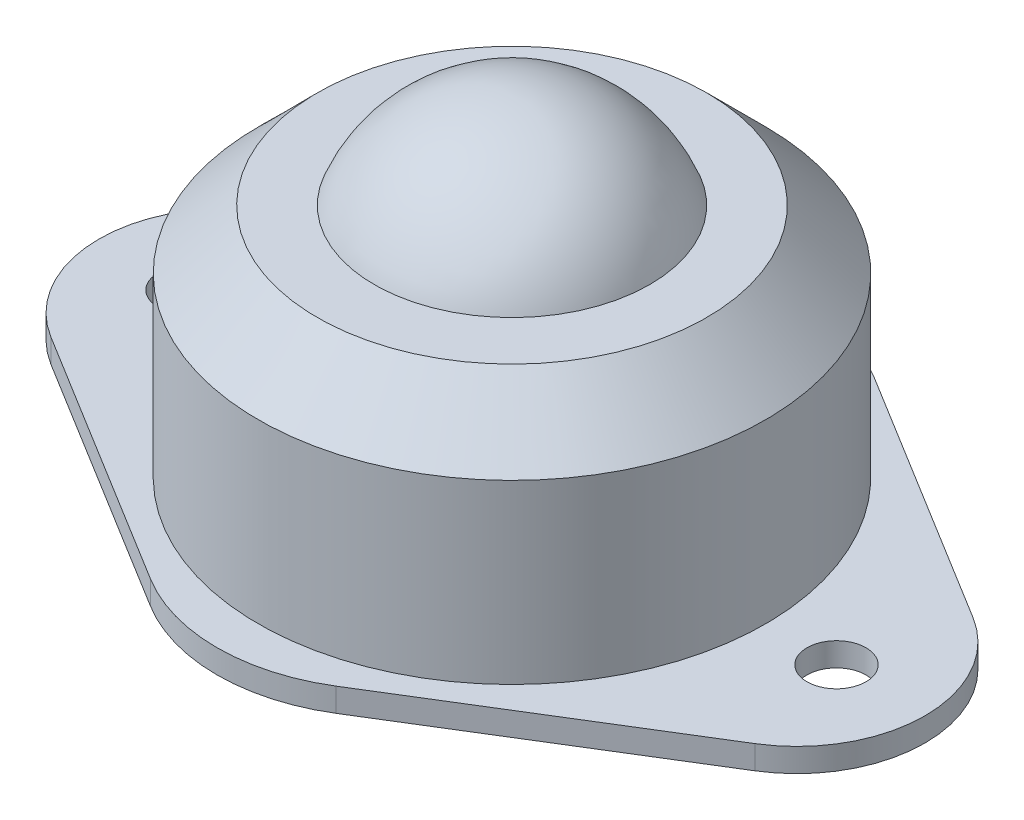
ISO-10303-21;
HEADER;
FILE_DESCRIPTION(('STEP AP214'),'2;1');
FILE_NAME('part.step','',(''),(''),'','','');
FILE_SCHEMA(('AUTOMOTIVE_DESIGN { 1 0 10303 214 1 1 1 1 }'));
ENDSEC;
DATA;
#1=APPLICATION_CONTEXT('core data for automotive mechanical design processes');
#2=APPLICATION_PROTOCOL_DEFINITION('international standard','automotive_design',2000,#1);
#3=PRODUCT_CONTEXT('',#1,'mechanical');
#4=PRODUCT('Part','Part','',(#3));
#5=PRODUCT_RELATED_PRODUCT_CATEGORY('part','',(#4));
#6=PRODUCT_DEFINITION_FORMATION('','',#4);
#7=PRODUCT_DEFINITION_CONTEXT('part definition',#1,'design');
#8=PRODUCT_DEFINITION('design','',#6,#7);
#9=PRODUCT_DEFINITION_SHAPE('','',#8);
#10=(LENGTH_UNIT() NAMED_UNIT(*) SI_UNIT(.MILLI.,.METRE.));
#11=(NAMED_UNIT(*) PLANE_ANGLE_UNIT() SI_UNIT($,.RADIAN.));
#12=(NAMED_UNIT(*) SI_UNIT($,.STERADIAN.) SOLID_ANGLE_UNIT());
#13=UNCERTAINTY_MEASURE_WITH_UNIT(LENGTH_MEASURE(1.E-05),#10,'distance_accuracy_value','');
#14=(GEOMETRIC_REPRESENTATION_CONTEXT(3) GLOBAL_UNCERTAINTY_ASSIGNED_CONTEXT((#13)) GLOBAL_UNIT_ASSIGNED_CONTEXT((#10,
#11,#12)) REPRESENTATION_CONTEXT('',''));
#15=CARTESIAN_POINT('',(0.,0.,0.));
#16=DIRECTION('',(0.,0.,1.));
#17=DIRECTION('',(1.,0.,0.));
#18=AXIS2_PLACEMENT_3D('',#15,#16,#17);
#19=CARTESIAN_POINT('',(0.,0.,0.));
#20=DIRECTION('',(0.,-1.,0.));
#21=DIRECTION('',(1.,0.,0.));
#22=AXIS2_PLACEMENT_3D('',#19,#20,#21);
#23=SPHERICAL_SURFACE('',#22,12.5);
#24=CARTESIAN_POINT('',(0.,4.48054135447175,0.));
#25=DIRECTION('',(0.,-1.,0.));
#26=DIRECTION('',(0.,0.,-1.));
#27=AXIS2_PLACEMENT_3D('',#24,#25,#26);
#28=CIRCLE('',#27,11.6693936933702);
#29=CARTESIAN_POINT('',(0.,4.48054135447175,-11.6693936933702));
#30=VERTEX_POINT('',#29);
#31=EDGE_CURVE('E11',#30,#30,#28,.T.);
#32=ORIENTED_EDGE('',*,*,#31,.F.);
#33=EDGE_LOOP('',(#32));
#34=FACE_BOUND('',#33,.T.);
#35=ADVANCED_FACE('F40',(#34),#23,.T.);
#36=CARTESIAN_POINT('',(0.,4.48054135447175,0.));
#37=DIRECTION('',(0.,-1.,0.));
#38=DIRECTION('',(0.,0.,-1.));
#39=AXIS2_PLACEMENT_3D('',#36,#37,#38);
#40=PLANE('',#39);
#41=CARTESIAN_POINT('',(0.,4.48054135447175,0.));
#42=DIRECTION('',(0.,-1.,0.));
#43=DIRECTION('',(0.,0.,-1.));
#44=AXIS2_PLACEMENT_3D('',#41,#42,#43);
#45=CIRCLE('',#44,16.5);
#46=CARTESIAN_POINT('',(0.,4.48054135447175,-16.5));
#47=VERTEX_POINT('',#46);
#48=EDGE_CURVE('E49',#47,#47,#45,.T.);
#49=ORIENTED_EDGE('',*,*,#48,.F.);
#50=EDGE_LOOP('',(#49));
#51=FACE_BOUND('',#50,.T.);
#52=ORIENTED_EDGE('',*,*,#31,.T.);
#53=EDGE_LOOP('',(#52));
#54=FACE_BOUND('',#53,.T.);
#55=ADVANCED_FACE('F201',(#51,#54),#40,.F.);
#56=CARTESIAN_POINT('',(0.,4.48054135447175,0.));
#57=DIRECTION('',(0.,-1.,0.));
#58=DIRECTION('',(0.,0.,-1.));
#59=AXIS2_PLACEMENT_3D('',#56,#57,#58);
#60=CONICAL_SURFACE('',#59,16.5,0.785398163397448);
#61=CARTESIAN_POINT('',(0.,-0.519458645528248,0.));
#62=DIRECTION('',(0.,-1.,0.));
#63=DIRECTION('',(0.,0.,-1.));
#64=AXIS2_PLACEMENT_3D('',#61,#62,#63);
#65=CIRCLE('',#64,21.5);
#66=CARTESIAN_POINT('',(0.,-0.519458645528248,-21.5));
#67=VERTEX_POINT('',#66);
#68=EDGE_CURVE('E192',#67,#67,#65,.T.);
#69=ORIENTED_EDGE('',*,*,#68,.F.);
#70=EDGE_LOOP('',(#69));
#71=FACE_BOUND('',#70,.T.);
#72=ORIENTED_EDGE('',*,*,#48,.T.);
#73=EDGE_LOOP('',(#72));
#74=FACE_BOUND('',#73,.T.);
#75=ADVANCED_FACE('F199',(#71,#74),#60,.T.);
#76=CARTESIAN_POINT('',(0.,0.,0.));
#77=DIRECTION('',(0.,-1.,0.));
#78=DIRECTION('',(0.,0.,-1.));
#79=AXIS2_PLACEMENT_3D('',#76,#77,#78);
#80=CYLINDRICAL_SURFACE('',#79,21.5);
#81=CARTESIAN_POINT('',(0.,-15.5,0.));
#82=DIRECTION('',(0.,-1.,0.));
#83=DIRECTION('',(0.,0.,-1.));
#84=AXIS2_PLACEMENT_3D('',#81,#82,#83);
#85=CIRCLE('',#84,21.5);
#86=CARTESIAN_POINT('',(0.,-15.5,-21.5));
#87=VERTEX_POINT('',#86);
#88=EDGE_CURVE('E188',#87,#87,#85,.T.);
#89=ORIENTED_EDGE('',*,*,#88,.F.);
#90=EDGE_LOOP('',(#89));
#91=FACE_BOUND('',#90,.T.);
#92=ORIENTED_EDGE('',*,*,#68,.T.);
#93=EDGE_LOOP('',(#92));
#94=FACE_BOUND('',#93,.T.);
#95=ADVANCED_FACE('F219',(#91,#94),#80,.T.);
#96=CARTESIAN_POINT('',(-24.1522308889656,-17.5,0.));
#97=DIRECTION('',(0.,1.,0.));
#98=DIRECTION('',(0.,0.,1.));
#99=AXIS2_PLACEMENT_3D('',#96,#97,#98);
#100=PLANE('',#99);
#101=CARTESIAN_POINT('',(-24.1522308889656,-17.5,0.));
#102=DIRECTION('',(0.,-1.,0.));
#103=DIRECTION('',(0.,0.,1.));
#104=AXIS2_PLACEMENT_3D('',#101,#102,#103);
#105=CIRCLE('',#104,10.8477691110344);
#106=CARTESIAN_POINT('',(-29.8413455005481,-17.5,9.23623676735229));
#107=VERTEX_POINT('',#106);
#108=CARTESIAN_POINT('',(-29.8413455005481,-17.5,-9.23623676735229));
#109=VERTEX_POINT('',#108);
#110=EDGE_CURVE('E166',#107,#109,#105,.T.);
#111=ORIENTED_EDGE('',*,*,#110,.T.);
#112=DIRECTION('',(0.851441127923454,0.,-0.524450193708075));
#113=VECTOR('',#112,1.);
#114=CARTESIAN_POINT('',(-29.8413455005481,-17.5,-9.23623676735229));
#115=LINE('',#114,#113);
#116=CARTESIAN_POINT('',(-7.86675290562112,-17.5,-22.7716169188518));
#117=VERTEX_POINT('',#116);
#118=EDGE_CURVE('E101',#109,#117,#115,.T.);
#119=ORIENTED_EDGE('',*,*,#118,.T.);
#120=CARTESIAN_POINT('',(0.,-17.5,-10.));
#121=DIRECTION('',(0.,-1.,0.));
#122=DIRECTION('',(0.,0.,1.));
#123=AXIS2_PLACEMENT_3D('',#120,#121,#122);
#124=CIRCLE('',#123,15.);
#125=CARTESIAN_POINT('',(7.86675290562112,-17.5,-22.7716169188518));
#126=VERTEX_POINT('',#125);
#127=EDGE_CURVE('E374',#117,#126,#124,.T.);
#128=ORIENTED_EDGE('',*,*,#127,.T.);
#129=DIRECTION('',(0.851441127923454,0.,0.524450193708075));
#130=VECTOR('',#129,1.);
#131=CARTESIAN_POINT('',(29.8413455005481,-17.5,-9.23623676735229));
#132=LINE('',#131,#130);
#133=CARTESIAN_POINT('',(29.8413455005481,-17.5,-9.23623676735229));
#134=VERTEX_POINT('',#133);
#135=EDGE_CURVE('E377',#126,#134,#132,.T.);
#136=ORIENTED_EDGE('',*,*,#135,.T.);
#137=CARTESIAN_POINT('',(24.1522308889656,-17.5,0.));
#138=DIRECTION('',(0.,-1.,0.));
#139=DIRECTION('',(0.,0.,-1.));
#140=AXIS2_PLACEMENT_3D('',#137,#138,#139);
#141=CIRCLE('',#140,10.8477691110344);
#142=CARTESIAN_POINT('',(29.8413455005481,-17.5,9.2362367673523));
#143=VERTEX_POINT('',#142);
#144=EDGE_CURVE('E121',#134,#143,#141,.T.);
#145=ORIENTED_EDGE('',*,*,#144,.T.);
#146=DIRECTION('',(-0.851441127923454,0.,0.524450193708075));
#147=VECTOR('',#146,1.);
#148=CARTESIAN_POINT('',(29.8413455005481,-17.5,9.23623676735229));
#149=LINE('',#148,#147);
#150=CARTESIAN_POINT('',(7.86675290562112,-17.5,22.7716169188518));
#151=VERTEX_POINT('',#150);
#152=EDGE_CURVE('E114',#143,#151,#149,.T.);
#153=ORIENTED_EDGE('',*,*,#152,.T.);
#154=CARTESIAN_POINT('',(0.,-17.5,9.99999999999999));
#155=DIRECTION('',(0.,-1.,0.));
#156=DIRECTION('',(0.,0.,-1.));
#157=AXIS2_PLACEMENT_3D('',#154,#155,#156);
#158=CIRCLE('',#157,15.);
#159=CARTESIAN_POINT('',(-7.86675290562111,-17.5,22.7716169188518));
#160=VERTEX_POINT('',#159);
#161=EDGE_CURVE('E119',#151,#160,#158,.T.);
#162=ORIENTED_EDGE('',*,*,#161,.T.);
#163=DIRECTION('',(-0.851441127923454,0.,-0.524450193708075));
#164=VECTOR('',#163,1.);
#165=CARTESIAN_POINT('',(-29.8413455005481,-17.5,9.23623676735229));
#166=LINE('',#165,#164);
#167=EDGE_CURVE('E57',#160,#107,#166,.T.);
#168=ORIENTED_EDGE('',*,*,#167,.T.);
#169=EDGE_LOOP('',(#111,#119,#128,#136,#145,#153,#162,#168));
#170=FACE_BOUND('',#169,.T.);
#171=CARTESIAN_POINT('',(-27.5,-17.5,0.));
#172=DIRECTION('',(0.,-1.,0.));
#173=DIRECTION('',(0.,0.,-1.));
#174=AXIS2_PLACEMENT_3D('',#171,#172,#173);
#175=CIRCLE('',#174,2.5);
#176=CARTESIAN_POINT('',(-27.5,-17.5,-2.50000000000001));
#177=VERTEX_POINT('',#176);
#178=EDGE_CURVE('E148',#177,#177,#175,.T.);
#179=ORIENTED_EDGE('',*,*,#178,.F.);
#180=EDGE_LOOP('',(#179));
#181=FACE_BOUND('',#180,.T.);
#182=CARTESIAN_POINT('',(27.5,-17.5,0.));
#183=DIRECTION('',(0.,-1.,0.));
#184=DIRECTION('',(0.,0.,1.));
#185=AXIS2_PLACEMENT_3D('',#182,#183,#184);
#186=CIRCLE('',#185,2.5);
#187=CARTESIAN_POINT('',(27.5,-17.5,2.49999999999999));
#188=VERTEX_POINT('',#187);
#189=EDGE_CURVE('E353',#188,#188,#186,.T.);
#190=ORIENTED_EDGE('',*,*,#189,.F.);
#191=EDGE_LOOP('',(#190));
#192=FACE_BOUND('',#191,.T.);
#193=ADVANCED_FACE('F116',(#170,#181,#192),#100,.F.);
#194=CARTESIAN_POINT('',(-24.1522308889656,-15.5,0.));
#195=DIRECTION('',(0.,1.,0.));
#196=DIRECTION('',(0.,0.,1.));
#197=AXIS2_PLACEMENT_3D('',#194,#195,#196);
#198=PLANE('',#197);
#199=ORIENTED_EDGE('',*,*,#88,.T.);
#200=EDGE_LOOP('',(#199));
#201=FACE_BOUND('',#200,.T.);
#202=CARTESIAN_POINT('',(-27.5,-15.5,0.));
#203=DIRECTION('',(0.,-1.,0.));
#204=DIRECTION('',(0.,0.,-1.));
#205=AXIS2_PLACEMENT_3D('',#202,#203,#204);
#206=CIRCLE('',#205,2.5);
#207=CARTESIAN_POINT('',(-27.5,-15.5,-2.50000000000001));
#208=VERTEX_POINT('',#207);
#209=EDGE_CURVE('E361',#208,#208,#206,.T.);
#210=ORIENTED_EDGE('',*,*,#209,.T.);
#211=EDGE_LOOP('',(#210));
#212=FACE_BOUND('',#211,.T.);
#213=CARTESIAN_POINT('',(-24.1522308889656,-15.5,0.));
#214=DIRECTION('',(0.,-1.,0.));
#215=DIRECTION('',(0.,0.,1.));
#216=AXIS2_PLACEMENT_3D('',#213,#214,#215);
#217=CIRCLE('',#216,10.8477691110344);
#218=CARTESIAN_POINT('',(-29.8413455005481,-15.5,9.23623676735229));
#219=VERTEX_POINT('',#218);
#220=CARTESIAN_POINT('',(-29.8413455005481,-15.5,-9.23623676735229));
#221=VERTEX_POINT('',#220);
#222=EDGE_CURVE('E143',#219,#221,#217,.T.);
#223=ORIENTED_EDGE('',*,*,#222,.F.);
#224=DIRECTION('',(-0.851441127923454,0.,-0.524450193708075));
#225=VECTOR('',#224,1.);
#226=CARTESIAN_POINT('',(-29.8413455005481,-15.5,9.23623676735229));
#227=LINE('',#226,#225);
#228=CARTESIAN_POINT('',(-7.86675290562111,-15.5,22.7716169188518));
#229=VERTEX_POINT('',#228);
#230=EDGE_CURVE('E92',#229,#219,#227,.T.);
#231=ORIENTED_EDGE('',*,*,#230,.F.);
#232=CARTESIAN_POINT('',(0.,-15.5,9.99999999999999));
#233=DIRECTION('',(0.,-1.,0.));
#234=DIRECTION('',(0.,0.,-1.));
#235=AXIS2_PLACEMENT_3D('',#232,#233,#234);
#236=CIRCLE('',#235,15.);
#237=CARTESIAN_POINT('',(7.86675290562112,-15.5,22.7716169188518));
#238=VERTEX_POINT('',#237);
#239=EDGE_CURVE('E86',#238,#229,#236,.T.);
#240=ORIENTED_EDGE('',*,*,#239,.F.);
#241=DIRECTION('',(-0.851441127923454,0.,0.524450193708075));
#242=VECTOR('',#241,1.);
#243=CARTESIAN_POINT('',(29.8413455005481,-15.5,9.23623676735229));
#244=LINE('',#243,#242);
#245=CARTESIAN_POINT('',(29.8413455005481,-15.5,9.2362367673523));
#246=VERTEX_POINT('',#245);
#247=EDGE_CURVE('E130',#246,#238,#244,.T.);
#248=ORIENTED_EDGE('',*,*,#247,.F.);
#249=CARTESIAN_POINT('',(24.1522308889656,-15.5,0.));
#250=DIRECTION('',(0.,-1.,0.));
#251=DIRECTION('',(0.,0.,-1.));
#252=AXIS2_PLACEMENT_3D('',#249,#250,#251);
#253=CIRCLE('',#252,10.8477691110344);
#254=CARTESIAN_POINT('',(29.8413455005481,-15.5,-9.23623676735229));
#255=VERTEX_POINT('',#254);
#256=EDGE_CURVE('E157',#255,#246,#253,.T.);
#257=ORIENTED_EDGE('',*,*,#256,.F.);
#258=DIRECTION('',(0.851441127923454,0.,0.524450193708075));
#259=VECTOR('',#258,1.);
#260=CARTESIAN_POINT('',(29.8413455005481,-15.5,-9.23623676735229));
#261=LINE('',#260,#259);
#262=CARTESIAN_POINT('',(7.86675290562112,-15.5,-22.7716169188518));
#263=VERTEX_POINT('',#262);
#264=EDGE_CURVE('E154',#263,#255,#261,.T.);
#265=ORIENTED_EDGE('',*,*,#264,.F.);
#266=CARTESIAN_POINT('',(0.,-15.5,-10.));
#267=DIRECTION('',(0.,-1.,0.));
#268=DIRECTION('',(0.,0.,1.));
#269=AXIS2_PLACEMENT_3D('',#266,#267,#268);
#270=CIRCLE('',#269,15.);
#271=CARTESIAN_POINT('',(-7.86675290562112,-15.5,-22.7716169188518));
#272=VERTEX_POINT('',#271);
#273=EDGE_CURVE('E151',#272,#263,#270,.T.);
#274=ORIENTED_EDGE('',*,*,#273,.F.);
#275=DIRECTION('',(0.851441127923454,0.,-0.524450193708075));
#276=VECTOR('',#275,1.);
#277=CARTESIAN_POINT('',(-29.8413455005481,-15.5,-9.23623676735229));
#278=LINE('',#277,#276);
#279=EDGE_CURVE('E147',#221,#272,#278,.T.);
#280=ORIENTED_EDGE('',*,*,#279,.F.);
#281=EDGE_LOOP('',(#223,#231,#240,#248,#257,#265,#274,#280));
#282=FACE_BOUND('',#281,.T.);
#283=CARTESIAN_POINT('',(27.5,-15.5,0.));
#284=DIRECTION('',(0.,-1.,0.));
#285=DIRECTION('',(0.,0.,1.));
#286=AXIS2_PLACEMENT_3D('',#283,#284,#285);
#287=CIRCLE('',#286,2.5);
#288=CARTESIAN_POINT('',(27.5,-15.5,2.49999999999999));
#289=VERTEX_POINT('',#288);
#290=EDGE_CURVE('E356',#289,#289,#287,.T.);
#291=ORIENTED_EDGE('',*,*,#290,.T.);
#292=EDGE_LOOP('',(#291));
#293=FACE_BOUND('',#292,.T.);
#294=ADVANCED_FACE('F234',(#201,#212,#282,#293),#198,.T.);
#295=CARTESIAN_POINT('',(-24.1522308889656,-17.5,0.));
#296=DIRECTION('',(0.,1.,0.));
#297=DIRECTION('',(0.,0.,1.));
#298=AXIS2_PLACEMENT_3D('',#295,#296,#297);
#299=CYLINDRICAL_SURFACE('',#298,10.8477691110344);
#300=ORIENTED_EDGE('',*,*,#222,.T.);
#301=DIRECTION('',(0.,1.,0.));
#302=VECTOR('',#301,1.);
#303=CARTESIAN_POINT('',(-29.8413455005481,-17.5,-9.23623676735229));
#304=LINE('',#303,#302);
#305=EDGE_CURVE('E185',#109,#221,#304,.T.);
#306=ORIENTED_EDGE('',*,*,#305,.F.);
#307=ORIENTED_EDGE('',*,*,#110,.F.);
#308=DIRECTION('',(0.,1.,0.));
#309=VECTOR('',#308,1.);
#310=CARTESIAN_POINT('',(-29.8413455005481,-17.5,9.23623676735229));
#311=LINE('',#310,#309);
#312=EDGE_CURVE('E139',#107,#219,#311,.T.);
#313=ORIENTED_EDGE('',*,*,#312,.T.);
#314=EDGE_LOOP('',(#300,#306,#307,#313));
#315=FACE_BOUND('',#314,.T.);
#316=ADVANCED_FACE('F241',(#315),#299,.T.);
#317=CARTESIAN_POINT('',(-29.8413455005481,-17.5,-9.23623676735229));
#318=DIRECTION('',(0.524450193708075,0.,0.851441127923454));
#319=DIRECTION('',(0.851441127923454,0.,-0.524450193708075));
#320=AXIS2_PLACEMENT_3D('',#317,#318,#319);
#321=PLANE('',#320);
#322=ORIENTED_EDGE('',*,*,#279,.T.);
#323=DIRECTION('',(0.,1.,0.));
#324=VECTOR('',#323,1.);
#325=CARTESIAN_POINT('',(-7.86675290562112,-17.5,-22.7716169188518));
#326=LINE('',#325,#324);
#327=EDGE_CURVE('E181',#117,#272,#326,.T.);
#328=ORIENTED_EDGE('',*,*,#327,.F.);
#329=ORIENTED_EDGE('',*,*,#118,.F.);
#330=ORIENTED_EDGE('',*,*,#305,.T.);
#331=EDGE_LOOP('',(#322,#328,#329,#330));
#332=FACE_BOUND('',#331,.T.);
#333=ADVANCED_FACE('F249',(#332),#321,.F.);
#334=CARTESIAN_POINT('',(0.,-17.5,-10.));
#335=DIRECTION('',(0.,1.,0.));
#336=DIRECTION('',(0.,0.,1.));
#337=AXIS2_PLACEMENT_3D('',#334,#335,#336);
#338=CYLINDRICAL_SURFACE('',#337,15.);
#339=ORIENTED_EDGE('',*,*,#273,.T.);
#340=DIRECTION('',(0.,1.,0.));
#341=VECTOR('',#340,1.);
#342=CARTESIAN_POINT('',(7.86675290562112,-17.5,-22.7716169188518));
#343=LINE('',#342,#341);
#344=EDGE_CURVE('E177',#126,#263,#343,.T.);
#345=ORIENTED_EDGE('',*,*,#344,.F.);
#346=ORIENTED_EDGE('',*,*,#127,.F.);
#347=ORIENTED_EDGE('',*,*,#327,.T.);
#348=EDGE_LOOP('',(#339,#345,#346,#347));
#349=FACE_BOUND('',#348,.T.);
#350=ADVANCED_FACE('F257',(#349),#338,.T.);
#351=CARTESIAN_POINT('',(29.8413455005481,-17.5,-9.23623676735229));
#352=DIRECTION('',(-0.524450193708075,0.,0.851441127923454));
#353=DIRECTION('',(0.851441127923454,0.,0.524450193708075));
#354=AXIS2_PLACEMENT_3D('',#351,#352,#353);
#355=PLANE('',#354);
#356=ORIENTED_EDGE('',*,*,#264,.T.);
#357=DIRECTION('',(0.,1.,0.));
#358=VECTOR('',#357,1.);
#359=CARTESIAN_POINT('',(29.8413455005481,-17.5,-9.23623676735229));
#360=LINE('',#359,#358);
#361=EDGE_CURVE('E173',#134,#255,#360,.T.);
#362=ORIENTED_EDGE('',*,*,#361,.F.);
#363=ORIENTED_EDGE('',*,*,#135,.F.);
#364=ORIENTED_EDGE('',*,*,#344,.T.);
#365=EDGE_LOOP('',(#356,#362,#363,#364));
#366=FACE_BOUND('',#365,.T.);
#367=ADVANCED_FACE('F264',(#366),#355,.F.);
#368=CARTESIAN_POINT('',(24.1522308889656,-17.5,0.));
#369=DIRECTION('',(0.,1.,0.));
#370=DIRECTION('',(0.,0.,1.));
#371=AXIS2_PLACEMENT_3D('',#368,#369,#370);
#372=CYLINDRICAL_SURFACE('',#371,10.8477691110344);
#373=ORIENTED_EDGE('',*,*,#256,.T.);
#374=DIRECTION('',(0.,1.,0.));
#375=VECTOR('',#374,1.);
#376=CARTESIAN_POINT('',(29.8413455005481,-17.5,9.2362367673523));
#377=LINE('',#376,#375);
#378=EDGE_CURVE('E132',#143,#246,#377,.T.);
#379=ORIENTED_EDGE('',*,*,#378,.F.);
#380=ORIENTED_EDGE('',*,*,#144,.F.);
#381=ORIENTED_EDGE('',*,*,#361,.T.);
#382=EDGE_LOOP('',(#373,#379,#380,#381));
#383=FACE_BOUND('',#382,.T.);
#384=ADVANCED_FACE('F272',(#383),#372,.T.);
#385=CARTESIAN_POINT('',(29.8413455005481,-17.5,9.23623676735229));
#386=DIRECTION('',(-0.524450193708075,0.,-0.851441127923454));
#387=DIRECTION('',(-0.851441127923454,0.,0.524450193708075));
#388=AXIS2_PLACEMENT_3D('',#385,#386,#387);
#389=PLANE('',#388);
#390=ORIENTED_EDGE('',*,*,#247,.T.);
#391=DIRECTION('',(0.,1.,0.));
#392=VECTOR('',#391,1.);
#393=CARTESIAN_POINT('',(7.86675290562112,-17.5,22.7716169188518));
#394=LINE('',#393,#392);
#395=EDGE_CURVE('E127',#151,#238,#394,.T.);
#396=ORIENTED_EDGE('',*,*,#395,.F.);
#397=ORIENTED_EDGE('',*,*,#152,.F.);
#398=ORIENTED_EDGE('',*,*,#378,.T.);
#399=EDGE_LOOP('',(#390,#396,#397,#398));
#400=FACE_BOUND('',#399,.T.);
#401=ADVANCED_FACE('F128',(#400),#389,.F.);
#402=CARTESIAN_POINT('',(0.,-17.5,9.99999999999999));
#403=DIRECTION('',(0.,1.,0.));
#404=DIRECTION('',(0.,0.,1.));
#405=AXIS2_PLACEMENT_3D('',#402,#403,#404);
#406=CYLINDRICAL_SURFACE('',#405,15.);
#407=ORIENTED_EDGE('',*,*,#239,.T.);
#408=DIRECTION('',(0.,1.,0.));
#409=VECTOR('',#408,1.);
#410=CARTESIAN_POINT('',(-7.86675290562111,-17.5,22.7716169188518));
#411=LINE('',#410,#409);
#412=EDGE_CURVE('E133',#160,#229,#411,.T.);
#413=ORIENTED_EDGE('',*,*,#412,.F.);
#414=ORIENTED_EDGE('',*,*,#161,.F.);
#415=ORIENTED_EDGE('',*,*,#395,.T.);
#416=EDGE_LOOP('',(#407,#413,#414,#415));
#417=FACE_BOUND('',#416,.T.);
#418=ADVANCED_FACE('F135',(#417),#406,.T.);
#419=CARTESIAN_POINT('',(-29.8413455005481,-17.5,9.23623676735229));
#420=DIRECTION('',(0.524450193708075,0.,-0.851441127923454));
#421=DIRECTION('',(-0.851441127923454,0.,-0.524450193708075));
#422=AXIS2_PLACEMENT_3D('',#419,#420,#421);
#423=PLANE('',#422);
#424=ORIENTED_EDGE('',*,*,#230,.T.);
#425=ORIENTED_EDGE('',*,*,#312,.F.);
#426=ORIENTED_EDGE('',*,*,#167,.F.);
#427=ORIENTED_EDGE('',*,*,#412,.T.);
#428=EDGE_LOOP('',(#424,#425,#426,#427));
#429=FACE_BOUND('',#428,.T.);
#430=ADVANCED_FACE('F293',(#429),#423,.F.);
#431=CARTESIAN_POINT('',(-27.5,-17.5,0.));
#432=DIRECTION('',(0.,1.,0.));
#433=DIRECTION('',(0.,0.,1.));
#434=AXIS2_PLACEMENT_3D('',#431,#432,#433);
#435=CYLINDRICAL_SURFACE('',#434,2.5);
#436=ORIENTED_EDGE('',*,*,#178,.T.);
#437=EDGE_LOOP('',(#436));
#438=FACE_BOUND('',#437,.T.);
#439=ORIENTED_EDGE('',*,*,#209,.F.);
#440=EDGE_LOOP('',(#439));
#441=FACE_BOUND('',#440,.T.);
#442=ADVANCED_FACE('F300',(#438,#441),#435,.F.);
#443=CARTESIAN_POINT('',(27.5,-17.5,0.));
#444=DIRECTION('',(0.,1.,0.));
#445=DIRECTION('',(0.,0.,1.));
#446=AXIS2_PLACEMENT_3D('',#443,#444,#445);
#447=CYLINDRICAL_SURFACE('',#446,2.5);
#448=ORIENTED_EDGE('',*,*,#189,.T.);
#449=EDGE_LOOP('',(#448));
#450=FACE_BOUND('',#449,.T.);
#451=ORIENTED_EDGE('',*,*,#290,.F.);
#452=EDGE_LOOP('',(#451));
#453=FACE_BOUND('',#452,.T.);
#454=ADVANCED_FACE('F307',(#450,#453),#447,.F.);
#455=CLOSED_SHELL('',(#35,#55,#75,#95,#193,#294,#316,#333,#350,#367,#384,#401,#418,#430,#442,#454));
#456=MANIFOLD_SOLID_BREP('B2',#455);
#457=ADVANCED_BREP_SHAPE_REPRESENTATION('',(#18,#456),#14);
#458=SHAPE_DEFINITION_REPRESENTATION(#9,#457);
ENDSEC;
END-ISO-10303-21;
